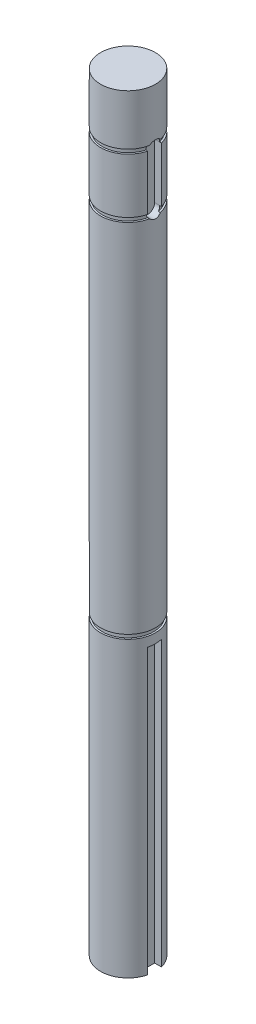
ISO-10303-21;
HEADER;
FILE_DESCRIPTION(('STEP AP214'),'2;1');
FILE_NAME('part.step','',(''),(''),'','','');
FILE_SCHEMA(('AUTOMOTIVE_DESIGN { 1 0 10303 214 1 1 1 1 }'));
ENDSEC;
DATA;
#1=APPLICATION_CONTEXT('core data for automotive mechanical design processes');
#2=APPLICATION_PROTOCOL_DEFINITION('international standard','automotive_design',2000,#1);
#3=PRODUCT_CONTEXT('',#1,'mechanical');
#4=PRODUCT('Part','Part','',(#3));
#5=PRODUCT_RELATED_PRODUCT_CATEGORY('part','',(#4));
#6=PRODUCT_DEFINITION_FORMATION('','',#4);
#7=PRODUCT_DEFINITION_CONTEXT('part definition',#1,'design');
#8=PRODUCT_DEFINITION('design','',#6,#7);
#9=PRODUCT_DEFINITION_SHAPE('','',#8);
#10=(LENGTH_UNIT() NAMED_UNIT(*) SI_UNIT(.MILLI.,.METRE.));
#11=(NAMED_UNIT(*) PLANE_ANGLE_UNIT() SI_UNIT($,.RADIAN.));
#12=(NAMED_UNIT(*) SI_UNIT($,.STERADIAN.) SOLID_ANGLE_UNIT());
#13=UNCERTAINTY_MEASURE_WITH_UNIT(LENGTH_MEASURE(1.E-05),#10,'distance_accuracy_value','');
#14=(GEOMETRIC_REPRESENTATION_CONTEXT(3) GLOBAL_UNCERTAINTY_ASSIGNED_CONTEXT((#13)) GLOBAL_UNIT_ASSIGNED_CONTEXT((#10,
#11,#12)) REPRESENTATION_CONTEXT('',''));
#15=CARTESIAN_POINT('',(0.,0.,0.));
#16=DIRECTION('',(0.,0.,1.));
#17=DIRECTION('',(1.,0.,0.));
#18=AXIS2_PLACEMENT_3D('',#15,#16,#17);
#19=CARTESIAN_POINT('',(0.,0.,0.));
#20=DIRECTION('',(0.,1.,0.));
#21=DIRECTION('',(0.,0.,1.));
#22=AXIS2_PLACEMENT_3D('',#19,#20,#21);
#23=PLANE('',#22);
#24=DIRECTION('',(1.,0.,0.));
#25=VECTOR('',#24,1.);
#26=CARTESIAN_POINT('',(0.,0.,-0.625000000000001));
#27=LINE('',#26,#25);
#28=CARTESIAN_POINT('',(1.8,0.,-0.625000000000001));
#29=VERTEX_POINT('',#28);
#30=CARTESIAN_POINT('',(2.42061459137964,0.,-0.624999999999992));
#31=VERTEX_POINT('',#30);
#32=EDGE_CURVE('E156',#29,#31,#27,.T.);
#33=ORIENTED_EDGE('',*,*,#32,.F.);
#34=DIRECTION('',(0.,0.,1.));
#35=VECTOR('',#34,1.);
#36=CARTESIAN_POINT('',(1.8,0.,0.));
#37=LINE('',#36,#35);
#38=CARTESIAN_POINT('',(1.8,0.,0.624999999999999));
#39=VERTEX_POINT('',#38);
#40=EDGE_CURVE('E11',#29,#39,#37,.T.);
#41=ORIENTED_EDGE('',*,*,#40,.T.);
#42=DIRECTION('',(1.,0.,0.));
#43=VECTOR('',#42,1.);
#44=CARTESIAN_POINT('',(0.,0.,0.624999999999999));
#45=LINE('',#44,#43);
#46=CARTESIAN_POINT('',(2.42061459137964,0.,0.625000000000008));
#47=VERTEX_POINT('',#46);
#48=EDGE_CURVE('E153',#39,#47,#45,.T.);
#49=ORIENTED_EDGE('',*,*,#48,.T.);
#50=CARTESIAN_POINT('',(0.,0.,0.));
#51=DIRECTION('',(0.,1.,0.));
#52=DIRECTION('',(0.,0.,1.));
#53=AXIS2_PLACEMENT_3D('',#50,#51,#52);
#54=CIRCLE('',#53,2.5);
#55=EDGE_CURVE('E291',#31,#47,#54,.T.);
#56=ORIENTED_EDGE('',*,*,#55,.F.);
#57=EDGE_LOOP('',(#33,#41,#49,#56));
#58=FACE_BOUND('',#57,.T.);
#59=ADVANCED_FACE('F33',(#58),#23,.F.);
#60=CARTESIAN_POINT('',(0.,70.,0.));
#61=DIRECTION('',(0.,-1.,0.));
#62=DIRECTION('',(0.,0.,-1.));
#63=AXIS2_PLACEMENT_3D('',#60,#61,#62);
#64=CYLINDRICAL_SURFACE('',#63,2.5);
#65=CARTESIAN_POINT('',(0.,26.72,0.));
#66=DIRECTION('',(0.,-1.,0.));
#67=DIRECTION('',(0.,0.,-1.));
#68=AXIS2_PLACEMENT_3D('',#65,#66,#67);
#69=CIRCLE('',#68,2.5);
#70=CARTESIAN_POINT('',(0.,26.72,-2.5));
#71=VERTEX_POINT('',#70);
#72=EDGE_CURVE('E231',#71,#71,#69,.T.);
#73=ORIENTED_EDGE('',*,*,#72,.T.);
#74=EDGE_LOOP('',(#73));
#75=FACE_BOUND('',#74,.T.);
#76=CARTESIAN_POINT('',(0.,25.86,0.));
#77=DIRECTION('',(0.,-1.,0.));
#78=DIRECTION('',(0.,0.,-1.));
#79=AXIS2_PLACEMENT_3D('',#76,#77,#78);
#80=CIRCLE('',#79,2.5);
#81=CARTESIAN_POINT('',(2.42061459137964,25.86,-0.624999999999998));
#82=VERTEX_POINT('',#81);
#83=CARTESIAN_POINT('',(2.42061459137964,25.86,0.625000000000002));
#84=VERTEX_POINT('',#83);
#85=EDGE_CURVE('E238',#82,#84,#80,.T.);
#86=ORIENTED_EDGE('',*,*,#85,.F.);
#87=DIRECTION('',(0.,-1.,0.));
#88=VECTOR('',#87,1.);
#89=CARTESIAN_POINT('',(2.42061459137964,70.,-0.624999999999992));
#90=LINE('',#89,#88);
#91=EDGE_CURVE('E42',#31,#82,#90,.F.);
#92=ORIENTED_EDGE('',*,*,#91,.F.);
#93=ORIENTED_EDGE('',*,*,#55,.T.);
#94=DIRECTION('',(0.,-1.,0.));
#95=VECTOR('',#94,1.);
#96=CARTESIAN_POINT('',(2.42061459137964,70.,0.625000000000008));
#97=LINE('',#96,#95);
#98=EDGE_CURVE('E294',#47,#84,#97,.F.);
#99=ORIENTED_EDGE('',*,*,#98,.T.);
#100=EDGE_LOOP('',(#86,#92,#93,#99));
#101=FACE_BOUND('',#100,.T.);
#102=ADVANCED_FACE('F283',(#75,#101),#64,.T.);
#103=DIRECTION('',(0.,-1.,0.));
#104=VECTOR('',#103,1.);
#105=CARTESIAN_POINT('',(2.42061459137964,70.,-0.624999999999999));
#106=LINE('',#105,#104);
#107=CARTESIAN_POINT('',(2.42061459137964,60.,-0.625));
#108=VERTEX_POINT('',#107);
#109=CARTESIAN_POINT('',(2.42061459137964,65.,-0.625));
#110=VERTEX_POINT('',#109);
#111=EDGE_CURVE('E377',#108,#110,#106,.F.);
#112=ORIENTED_EDGE('',*,*,#111,.F.);
#113=CARTESIAN_POINT('',(0.,60.,0.));
#114=DIRECTION('',(0.,1.,0.));
#115=DIRECTION('',(0.,0.,1.));
#116=AXIS2_PLACEMENT_3D('',#113,#114,#115);
#117=CIRCLE('',#116,2.5);
#118=CARTESIAN_POINT('',(2.42061459137964,60.,0.624999999999999));
#119=VERTEX_POINT('',#118);
#120=EDGE_CURVE('E330',#108,#119,#117,.T.);
#121=ORIENTED_EDGE('',*,*,#120,.T.);
#122=DIRECTION('',(0.,-1.,0.));
#123=VECTOR('',#122,1.);
#124=CARTESIAN_POINT('',(2.42061459137964,70.,0.625000000000001));
#125=LINE('',#124,#123);
#126=CARTESIAN_POINT('',(2.42061459137964,65.,0.625));
#127=VERTEX_POINT('',#126);
#128=EDGE_CURVE('E378',#119,#127,#125,.F.);
#129=ORIENTED_EDGE('',*,*,#128,.T.);
#130=CARTESIAN_POINT('',(0.,65.,0.));
#131=DIRECTION('',(0.,-1.,0.));
#132=DIRECTION('',(0.,0.,-1.));
#133=AXIS2_PLACEMENT_3D('',#130,#131,#132);
#134=CIRCLE('',#133,2.5);
#135=EDGE_CURVE('E353',#127,#110,#134,.T.);
#136=ORIENTED_EDGE('',*,*,#135,.T.);
#137=EDGE_LOOP('',(#112,#121,#129,#136));
#138=FACE_BOUND('',#137,.T.);
#139=ADVANCED_FACE('F278',(#138),#64,.T.);
#140=CARTESIAN_POINT('',(0.,65.,10.3427403474237));
#141=DIRECTION('',(0.,-1.,0.));
#142=DIRECTION('',(0.,0.,-1.));
#143=AXIS2_PLACEMENT_3D('',#140,#141,#142);
#144=PLANE('',#143);
#145=DIRECTION('',(1.,0.,0.));
#146=VECTOR('',#145,1.);
#147=CARTESIAN_POINT('',(1.8,65.,-0.625));
#148=LINE('',#147,#146);
#149=CARTESIAN_POINT('',(2.25498891349825,65.,-0.625));
#150=VERTEX_POINT('',#149);
#151=EDGE_CURVE('E177',#150,#110,#148,.T.);
#152=ORIENTED_EDGE('',*,*,#151,.T.);
#153=ORIENTED_EDGE('',*,*,#135,.F.);
#154=DIRECTION('',(1.,0.,0.));
#155=VECTOR('',#154,1.);
#156=CARTESIAN_POINT('',(1.8,65.,0.625));
#157=LINE('',#156,#155);
#158=CARTESIAN_POINT('',(2.25498891349825,65.,0.625));
#159=VERTEX_POINT('',#158);
#160=EDGE_CURVE('E173',#159,#127,#157,.T.);
#161=ORIENTED_EDGE('',*,*,#160,.F.);
#162=CARTESIAN_POINT('',(0.,65.,0.));
#163=DIRECTION('',(0.,1.,0.));
#164=DIRECTION('',(0.,0.,1.));
#165=AXIS2_PLACEMENT_3D('',#162,#163,#164);
#166=CIRCLE('',#165,2.34);
#167=EDGE_CURVE('E345',#150,#159,#166,.T.);
#168=ORIENTED_EDGE('',*,*,#167,.F.);
#169=EDGE_LOOP('',(#152,#153,#161,#168));
#170=FACE_BOUND('',#169,.T.);
#171=ADVANCED_FACE('F274',(#170),#144,.F.);
#172=CARTESIAN_POINT('',(0.,65.39,10.3427403474237));
#173=DIRECTION('',(0.,1.,0.));
#174=DIRECTION('',(0.,0.,1.));
#175=AXIS2_PLACEMENT_3D('',#172,#173,#174);
#176=PLANE('',#175);
#177=CARTESIAN_POINT('',(0.,65.39,0.));
#178=DIRECTION('',(0.,1.,0.));
#179=DIRECTION('',(0.,0.,1.));
#180=AXIS2_PLACEMENT_3D('',#177,#178,#179);
#181=CIRCLE('',#180,2.34);
#182=CARTESIAN_POINT('',(2.28846564317667,65.39,-0.488390212842148));
#183=VERTEX_POINT('',#182);
#184=CARTESIAN_POINT('',(2.28846564317667,65.39,0.488390212842148));
#185=VERTEX_POINT('',#184);
#186=EDGE_CURVE('E342',#183,#185,#181,.T.);
#187=ORIENTED_EDGE('',*,*,#186,.T.);
#188=DIRECTION('',(1.,0.,0.));
#189=VECTOR('',#188,1.);
#190=CARTESIAN_POINT('',(1.8,65.39,0.488390212842148));
#191=LINE('',#190,#189);
#192=CARTESIAN_POINT('',(2.45183094849543,65.39,0.488390212842148));
#193=VERTEX_POINT('',#192);
#194=EDGE_CURVE('E260',#185,#193,#191,.T.);
#195=ORIENTED_EDGE('',*,*,#194,.T.);
#196=CARTESIAN_POINT('',(0.,65.39,0.));
#197=DIRECTION('',(0.,1.,0.));
#198=DIRECTION('',(0.,0.,1.));
#199=AXIS2_PLACEMENT_3D('',#196,#197,#198);
#200=CIRCLE('',#199,2.5);
#201=CARTESIAN_POINT('',(2.45183094849543,65.39,-0.488390212842148));
#202=VERTEX_POINT('',#201);
#203=EDGE_CURVE('E349',#202,#193,#200,.T.);
#204=ORIENTED_EDGE('',*,*,#203,.F.);
#205=DIRECTION('',(1.,0.,0.));
#206=VECTOR('',#205,1.);
#207=CARTESIAN_POINT('',(1.8,65.39,-0.488390212842148));
#208=LINE('',#207,#206);
#209=EDGE_CURVE('E376',#202,#183,#208,.F.);
#210=ORIENTED_EDGE('',*,*,#209,.T.);
#211=EDGE_LOOP('',(#187,#195,#204,#210));
#212=FACE_BOUND('',#211,.T.);
#213=ADVANCED_FACE('F272',(#212),#176,.F.);
#214=CARTESIAN_POINT('',(0.,67.145702963128,0.));
#215=DIRECTION('',(0.,1.,0.));
#216=DIRECTION('',(0.,0.,1.));
#217=AXIS2_PLACEMENT_3D('',#214,#215,#216);
#218=CYLINDRICAL_SURFACE('',#217,2.34);
#219=ORIENTED_EDGE('',*,*,#167,.T.);
#220=CARTESIAN_POINT('',(2.25498891349825,65.,0.625));
#221=CARTESIAN_POINT('',(2.2549577676071,65.0349451676806,0.625031242881273));
#222=CARTESIAN_POINT('',(2.25580142119508,65.0698639742977,0.62207010779259));
#223=CARTESIAN_POINT('',(2.2589500737712,65.1377027398278,0.610576459427105));
#224=CARTESIAN_POINT('',(2.26121368163625,65.1706512841825,0.602201551401812));
#225=CARTESIAN_POINT('',(2.26706996716942,65.2361109133674,0.579765859672448));
#226=CARTESIAN_POINT('',(2.27071829563075,65.2685342964658,0.565464301459904));
#227=CARTESIAN_POINT('',(2.27898384198627,65.3313752345228,0.531171536249042));
#228=CARTESIAN_POINT('',(2.28362684375595,65.361703429967,0.511022506756532));
#229=CARTESIAN_POINT('',(2.28846564317667,65.39,0.488390212842145));
#230=B_SPLINE_CURVE_WITH_KNOTS('',3,(#220,#221,#222,#223,#224,#225,#226,#227,#228,#229),
.UNSPECIFIED.,.F.,.F.,(4,2,2,2,4),(0.,0.104657709850381,0.206398045239275,0.312755280421573,
0.422303330243629),.UNSPECIFIED.);
#231=EDGE_CURVE('E259',#159,#185,#230,.T.);
#232=ORIENTED_EDGE('',*,*,#231,.T.);
#233=ORIENTED_EDGE('',*,*,#186,.F.);
#234=CARTESIAN_POINT('',(2.28846564317667,65.39,-0.488390212842148));
#235=CARTESIAN_POINT('',(2.28377829713318,65.3625732574471,-0.510321079523728));
#236=CARTESIAN_POINT('',(2.27927222148687,65.3332456660861,-0.529922187080841));
#237=CARTESIAN_POINT('',(2.27120447844851,65.2725098261348,-0.563495224923729));
#238=CARTESIAN_POINT('',(2.26761972594627,65.2411837706113,-0.577610547747851));
#239=CARTESIAN_POINT('',(2.26160985513081,65.1759739804003,-0.600727130319747));
#240=CARTESIAN_POINT('',(2.25920557537542,65.1420557151607,-0.609636984124143));
#241=CARTESIAN_POINT('',(2.25585465538172,65.0721223954405,-0.621878136616292));
#242=CARTESIAN_POINT('',(2.25495320411917,65.0360749974155,-0.625036746668476));
#243=CARTESIAN_POINT('',(2.25498891349825,65.,-0.625));
#244=B_SPLINE_CURVE_WITH_KNOTS('',3,(#234,#235,#236,#237,#238,#239,#240,#241,#242,#243),
.UNSPECIFIED.,.F.,.F.,(4,2,2,2,4),(0.,0.106169432309091,0.20933931542816,0.31427023276521,
0.42230292818043),.UNSPECIFIED.);
#245=EDGE_CURVE('E252',#183,#150,#244,.T.);
#246=ORIENTED_EDGE('',*,*,#245,.T.);
#247=EDGE_LOOP('',(#219,#232,#233,#246));
#248=FACE_BOUND('',#247,.T.);
#249=ADVANCED_FACE('F266',(#248),#218,.T.);
#250=CARTESIAN_POINT('',(0.,70.,0.));
#251=DIRECTION('',(0.,1.,0.));
#252=DIRECTION('',(0.,0.,1.));
#253=AXIS2_PLACEMENT_3D('',#250,#251,#252);
#254=PLANE('',#253);
#255=CARTESIAN_POINT('',(0.,70.,0.));
#256=DIRECTION('',(0.,1.,0.));
#257=DIRECTION('',(0.,0.,1.));
#258=AXIS2_PLACEMENT_3D('',#255,#256,#257);
#259=CIRCLE('',#258,2.5);
#260=CARTESIAN_POINT('',(0.,70.,2.5));
#261=VERTEX_POINT('',#260);
#262=EDGE_CURVE('E230',#261,#261,#259,.T.);
#263=ORIENTED_EDGE('',*,*,#262,.T.);
#264=EDGE_LOOP('',(#263));
#265=FACE_BOUND('',#264,.T.);
#266=ADVANCED_FACE('F271',(#265),#254,.T.);
#267=ORIENTED_EDGE('',*,*,#203,.T.);
#268=CARTESIAN_POINT('',(2.45183094849543,65.39,0.488390212842148));
#269=CARTESIAN_POINT('',(2.45620985079356,65.4175173550436,0.466446135173251));
#270=CARTESIAN_POINT('',(2.46073522955007,65.4431341262447,0.442157383459968));
#271=CARTESIAN_POINT('',(2.46959668145522,65.4899643442063,0.389604143855876));
#272=CARTESIAN_POINT('',(2.47393267692812,65.5111759973507,0.361338044349884));
#273=CARTESIAN_POINT('',(2.48193206156887,65.5485859134028,0.30153803479316));
#274=CARTESIAN_POINT('',(2.48559489195543,65.5647800189204,0.270001443630932));
#275=CARTESIAN_POINT('',(2.49183240360243,65.5916292851773,0.204569439455392));
#276=CARTESIAN_POINT('',(2.49440775858927,65.6022878762921,0.170675502100788));
#277=CARTESIAN_POINT('',(2.49814743480022,65.6175921843235,0.102075270104229));
#278=CARTESIAN_POINT('',(2.49933459123758,65.6223352975146,0.0673919786486349));
#279=CARTESIAN_POINT('',(2.500241728989,65.6259689049068,-0.00230266926769592));
#280=CARTESIAN_POINT('',(2.49996165472389,65.6248591774004,-0.0373140381059599));
#281=CARTESIAN_POINT('',(2.49798767082826,65.6169127391009,-0.10587479924824));
#282=CARTESIAN_POINT('',(2.49632412393997,65.6101990064931,-0.139439444588614));
#283=CARTESIAN_POINT('',(2.49180073116005,65.5914205546413,-0.204959205697202));
#284=CARTESIAN_POINT('',(2.48894057007017,65.5793544254805,-0.236913894902805));
#285=CARTESIAN_POINT('',(2.48228901347954,65.5500806489104,-0.298694706388588));
#286=CARTESIAN_POINT('',(2.47848772354246,65.5328179220008,-0.328493557902181));
#287=CARTESIAN_POINT('',(2.47037297246938,65.493691790764,-0.384793070669462));
#288=CARTESIAN_POINT('',(2.46606009386891,65.4718335976959,-0.411297414178223));
#289=CARTESIAN_POINT('',(2.4600624671058,65.4388766288402,-0.44517843984157));
#290=CARTESIAN_POINT('',(2.45840021313174,65.4294736153385,-0.454255959435429));
#291=CARTESIAN_POINT('',(2.45509547337905,65.4101333528005,-0.471789471966371));
#292=CARTESIAN_POINT('',(2.45345295711915,65.4001971076006,-0.480246566408103));
#293=CARTESIAN_POINT('',(2.45183094849543,65.39,-0.488390212842182));
#294=B_SPLINE_CURVE_WITH_KNOTS('',3,(#268,#269,#270,#271,#272,#273,#274,#275,#276,#277,#278,
#279,#280,#281,#282,#283,#284,#285,#286,#287,#288,#289,#290,#291,#292,#293),.UNSPECIFIED.,.F.,
.F.,(4,2,2,2,2,2,2,2,2,2,2,2,4),(0.,0.106271829539017,0.212586844928897,0.318989715642145,
0.425326569252446,0.529888464917002,0.634454321447651,0.736784052545574,0.839140755143262,
0.942623020441684,1.04598856376481,1.08549382972696,1.12492716962116),.UNSPECIFIED.);
#295=EDGE_CURVE('E229',#193,#202,#294,.T.);
#296=ORIENTED_EDGE('',*,*,#295,.T.);
#297=EDGE_LOOP('',(#267,#296));
#298=FACE_BOUND('',#297,.T.);
#299=ORIENTED_EDGE('',*,*,#262,.F.);
#300=EDGE_LOOP('',(#299));
#301=FACE_BOUND('',#300,.T.);
#302=ADVANCED_FACE('F35',(#298,#301),#64,.T.);
#303=CARTESIAN_POINT('',(0.,59.61,14.1547308574175));
#304=DIRECTION('',(0.,-1.,0.));
#305=DIRECTION('',(0.,0.,-1.));
#306=AXIS2_PLACEMENT_3D('',#303,#304,#305);
#307=PLANE('',#306);
#308=CARTESIAN_POINT('',(0.,59.61,0.));
#309=DIRECTION('',(0.,1.,0.));
#310=DIRECTION('',(0.,0.,1.));
#311=AXIS2_PLACEMENT_3D('',#308,#309,#310);
#312=CIRCLE('',#311,2.34);
#313=CARTESIAN_POINT('',(2.28846564317667,59.61,-0.488390212842154));
#314=VERTEX_POINT('',#313);
#315=CARTESIAN_POINT('',(2.28846564317667,59.61,0.488390212842154));
#316=VERTEX_POINT('',#315);
#317=EDGE_CURVE('E334',#314,#316,#312,.T.);
#318=ORIENTED_EDGE('',*,*,#317,.F.);
#319=DIRECTION('',(1.,0.,0.));
#320=VECTOR('',#319,1.);
#321=CARTESIAN_POINT('',(1.8,59.61,-0.488390212842154));
#322=LINE('',#321,#320);
#323=CARTESIAN_POINT('',(2.45183094849543,59.61,-0.488390212842154));
#324=VERTEX_POINT('',#323);
#325=EDGE_CURVE('E190',#314,#324,#322,.T.);
#326=ORIENTED_EDGE('',*,*,#325,.T.);
#327=CARTESIAN_POINT('',(0.,59.61,0.));
#328=DIRECTION('',(0.,-1.,0.));
#329=DIRECTION('',(0.,0.,-1.));
#330=AXIS2_PLACEMENT_3D('',#327,#328,#329);
#331=CIRCLE('',#330,2.5);
#332=CARTESIAN_POINT('',(2.45183094849543,59.61,0.488390212842154));
#333=VERTEX_POINT('',#332);
#334=EDGE_CURVE('E346',#333,#324,#331,.T.);
#335=ORIENTED_EDGE('',*,*,#334,.F.);
#336=DIRECTION('',(1.,0.,0.));
#337=VECTOR('',#336,1.);
#338=CARTESIAN_POINT('',(1.8,59.61,0.488390212842154));
#339=LINE('',#338,#337);
#340=EDGE_CURVE('E57',#333,#316,#339,.F.);
#341=ORIENTED_EDGE('',*,*,#340,.T.);
#342=EDGE_LOOP('',(#318,#326,#335,#341));
#343=FACE_BOUND('',#342,.T.);
#344=ADVANCED_FACE('F398',(#343),#307,.F.);
#345=CARTESIAN_POINT('',(0.,60.,14.1547308574175));
#346=DIRECTION('',(0.,1.,0.));
#347=DIRECTION('',(0.,0.,1.));
#348=AXIS2_PLACEMENT_3D('',#345,#346,#347);
#349=PLANE('',#348);
#350=ORIENTED_EDGE('',*,*,#120,.F.);
#351=DIRECTION('',(1.,0.,0.));
#352=VECTOR('',#351,1.);
#353=CARTESIAN_POINT('',(1.8,60.,-0.625));
#354=LINE('',#353,#352);
#355=CARTESIAN_POINT('',(2.25498891349825,60.,-0.625));
#356=VERTEX_POINT('',#355);
#357=EDGE_CURVE('E181',#356,#108,#354,.T.);
#358=ORIENTED_EDGE('',*,*,#357,.F.);
#359=CARTESIAN_POINT('',(0.,60.,0.));
#360=DIRECTION('',(0.,1.,0.));
#361=DIRECTION('',(0.,0.,1.));
#362=AXIS2_PLACEMENT_3D('',#359,#360,#361);
#363=CIRCLE('',#362,2.34);
#364=CARTESIAN_POINT('',(2.25498891349825,60.,0.624999999999999));
#365=VERTEX_POINT('',#364);
#366=EDGE_CURVE('E328',#356,#365,#363,.T.);
#367=ORIENTED_EDGE('',*,*,#366,.T.);
#368=DIRECTION('',(1.,0.,0.));
#369=VECTOR('',#368,1.);
#370=CARTESIAN_POINT('',(1.8,60.,0.624999999999999));
#371=LINE('',#370,#369);
#372=EDGE_CURVE('E185',#365,#119,#371,.T.);
#373=ORIENTED_EDGE('',*,*,#372,.T.);
#374=EDGE_LOOP('',(#350,#358,#367,#373));
#375=FACE_BOUND('',#374,.T.);
#376=ADVANCED_FACE('F327',(#375),#349,.F.);
#377=CARTESIAN_POINT('',(0.,61.0146084361061,0.));
#378=DIRECTION('',(0.,1.,0.));
#379=DIRECTION('',(0.,0.,1.));
#380=AXIS2_PLACEMENT_3D('',#377,#378,#379);
#381=CYLINDRICAL_SURFACE('',#380,2.34);
#382=ORIENTED_EDGE('',*,*,#317,.T.);
#383=CARTESIAN_POINT('',(2.28846564317667,59.61,0.488390212842154));
#384=CARTESIAN_POINT('',(2.28377829713318,59.6374267425529,0.510321079523733));
#385=CARTESIAN_POINT('',(2.27927222148687,59.6667543339139,0.529922187080846));
#386=CARTESIAN_POINT('',(2.27120447844851,59.7274901738653,0.563495224923732));
#387=CARTESIAN_POINT('',(2.26761972594627,59.7588162293887,0.577610547747853));
#388=CARTESIAN_POINT('',(2.26160985513081,59.8240260195997,0.600727130319747));
#389=CARTESIAN_POINT('',(2.25920557537542,59.8579442848393,0.609636984124142));
#390=CARTESIAN_POINT('',(2.25585465538172,59.9278776045595,0.62187813661629));
#391=CARTESIAN_POINT('',(2.25495320411917,59.9639250025846,0.625036746668475));
#392=CARTESIAN_POINT('',(2.25498891349825,60.,0.625));
#393=B_SPLINE_CURVE_WITH_KNOTS('',3,(#383,#384,#385,#386,#387,#388,#389,#390,#391,#392),
.UNSPECIFIED.,.F.,.F.,(4,2,2,2,4),(0.,0.106169432309084,0.209339315428145,0.314270232765202,
0.422302928180429),.UNSPECIFIED.);
#394=EDGE_CURVE('E201',#316,#365,#393,.T.);
#395=ORIENTED_EDGE('',*,*,#394,.T.);
#396=ORIENTED_EDGE('',*,*,#366,.F.);
#397=CARTESIAN_POINT('',(2.25498891349825,60.,-0.625));
#398=CARTESIAN_POINT('',(2.2549577676071,59.9650548323194,-0.625031242881273));
#399=CARTESIAN_POINT('',(2.25580142119508,59.9301360257023,-0.622070107792591));
#400=CARTESIAN_POINT('',(2.2589500737712,59.8622972601722,-0.610576459427107));
#401=CARTESIAN_POINT('',(2.26121368163625,59.8293487158175,-0.602201551401814));
#402=CARTESIAN_POINT('',(2.26706996716942,59.7638890866326,-0.579765859672454));
#403=CARTESIAN_POINT('',(2.27071829563075,59.7314657035342,-0.565464301459912));
#404=CARTESIAN_POINT('',(2.27898384198626,59.6686247654772,-0.531171536249052));
#405=CARTESIAN_POINT('',(2.28362684375595,59.638296570033,-0.511022506756541));
#406=CARTESIAN_POINT('',(2.28846564317667,59.61,-0.488390212842151));
#407=B_SPLINE_CURVE_WITH_KNOTS('',3,(#397,#398,#399,#400,#401,#402,#403,#404,#405,#406),
.UNSPECIFIED.,.F.,.F.,(4,2,2,2,4),(0.,0.10465770985038,0.206398045239267,0.312755280421562,
0.422303330243633),.UNSPECIFIED.);
#408=EDGE_CURVE('E193',#356,#314,#407,.T.);
#409=ORIENTED_EDGE('',*,*,#408,.T.);
#410=EDGE_LOOP('',(#382,#395,#396,#409));
#411=FACE_BOUND('',#410,.T.);
#412=ADVANCED_FACE('F206',(#411),#381,.T.);
#413=CARTESIAN_POINT('',(0.,27.11,0.));
#414=DIRECTION('',(0.,1.,0.));
#415=DIRECTION('',(0.,0.,1.));
#416=AXIS2_PLACEMENT_3D('',#413,#414,#415);
#417=CIRCLE('',#416,2.5);
#418=CARTESIAN_POINT('',(0.,27.11,2.5));
#419=VERTEX_POINT('',#418);
#420=EDGE_CURVE('E338',#419,#419,#417,.T.);
#421=ORIENTED_EDGE('',*,*,#420,.T.);
#422=EDGE_LOOP('',(#421));
#423=FACE_BOUND('',#422,.T.);
#424=ORIENTED_EDGE('',*,*,#334,.T.);
#425=CARTESIAN_POINT('',(2.45183094849543,59.61,-0.488390212842154));
#426=CARTESIAN_POINT('',(2.45620985079355,59.5824826449564,-0.466446135173262));
#427=CARTESIAN_POINT('',(2.46073522955007,59.5568658737553,-0.442157383459975));
#428=CARTESIAN_POINT('',(2.46959668145522,59.5100356557937,-0.389604143855875));
#429=CARTESIAN_POINT('',(2.47393267692812,59.4888240026494,-0.36133804434988));
#430=CARTESIAN_POINT('',(2.48193206156887,59.4514140865972,-0.301538034793154));
#431=CARTESIAN_POINT('',(2.48559489195543,59.4352199810796,-0.270001443630927));
#432=CARTESIAN_POINT('',(2.49183240360243,59.4083707148226,-0.204569439455387));
#433=CARTESIAN_POINT('',(2.49440775858927,59.3977121237079,-0.170675502100782));
#434=CARTESIAN_POINT('',(2.49814743480022,59.3824078156765,-0.102075270104223));
#435=CARTESIAN_POINT('',(2.49933459123758,59.3776647024854,-0.0673919786486295));
#436=CARTESIAN_POINT('',(2.500241728989,59.3740310950932,0.00230266926770128));
#437=CARTESIAN_POINT('',(2.49996165472389,59.3751408225996,0.0373140381059658));
#438=CARTESIAN_POINT('',(2.49798767082826,59.3830872608991,0.105874799248246));
#439=CARTESIAN_POINT('',(2.49632412393997,59.3898009935069,0.139439444588619));
#440=CARTESIAN_POINT('',(2.49180073116005,59.4085794453587,0.204959205697207));
#441=CARTESIAN_POINT('',(2.48894057007017,59.4206455745195,0.236913894902809));
#442=CARTESIAN_POINT('',(2.48228901347954,59.4499193510896,0.298694706388591));
#443=CARTESIAN_POINT('',(2.47848772354246,59.4671820779992,0.328493557902184));
#444=CARTESIAN_POINT('',(2.47037297246938,59.506308209236,0.384793070669467));
#445=CARTESIAN_POINT('',(2.46606009386891,59.5281664023041,0.411297414178229));
#446=CARTESIAN_POINT('',(2.4600624671058,59.5611233711598,0.445178439841572));
#447=CARTESIAN_POINT('',(2.45840021313174,59.5705263846615,0.454255959435428));
#448=CARTESIAN_POINT('',(2.45509547337905,59.5898666471995,0.47178947196637));
#449=CARTESIAN_POINT('',(2.45345295711915,59.5998028923994,0.480246566408104));
#450=CARTESIAN_POINT('',(2.45183094849543,59.61,0.488390212842188));
#451=B_SPLINE_CURVE_WITH_KNOTS('',3,(#425,#426,#427,#428,#429,#430,#431,#432,#433,#434,#435,
#436,#437,#438,#439,#440,#441,#442,#443,#444,#445,#446,#447,#448,#449,#450),.UNSPECIFIED.,.F.,
.F.,(4,2,2,2,2,2,2,2,2,2,2,2,4),(0.,0.106271829539031,0.212586844928905,0.318989715642164,
0.425326569252458,0.529888464917014,0.634454321447664,0.736784052545585,0.839140755143276,
0.942623020441693,1.04598856376482,1.08549382972697,1.12492716962118),.UNSPECIFIED.);
#452=EDGE_CURVE('E223',#324,#333,#451,.T.);
#453=ORIENTED_EDGE('',*,*,#452,.T.);
#454=EDGE_LOOP('',(#424,#453));
#455=FACE_BOUND('',#454,.T.);
#456=ADVANCED_FACE('F385',(#423,#455),#64,.T.);
#457=CARTESIAN_POINT('',(0.,26.72,14.9775105981988));
#458=DIRECTION('',(0.,-1.,0.));
#459=DIRECTION('',(0.,0.,-1.));
#460=AXIS2_PLACEMENT_3D('',#457,#458,#459);
#461=PLANE('',#460);
#462=CARTESIAN_POINT('',(0.,26.72,0.));
#463=DIRECTION('',(0.,1.,0.));
#464=DIRECTION('',(0.,0.,1.));
#465=AXIS2_PLACEMENT_3D('',#462,#463,#464);
#466=CIRCLE('',#465,2.34);
#467=CARTESIAN_POINT('',(0.,26.72,2.34));
#468=VERTEX_POINT('',#467);
#469=EDGE_CURVE('E340',#468,#468,#466,.T.);
#470=ORIENTED_EDGE('',*,*,#469,.F.);
#471=EDGE_LOOP('',(#470));
#472=FACE_BOUND('',#471,.T.);
#473=ORIENTED_EDGE('',*,*,#72,.F.);
#474=EDGE_LOOP('',(#473));
#475=FACE_BOUND('',#474,.T.);
#476=ADVANCED_FACE('F389',(#472,#475),#461,.F.);
#477=CARTESIAN_POINT('',(0.,27.11,14.9775105981988));
#478=DIRECTION('',(0.,1.,0.));
#479=DIRECTION('',(0.,0.,1.));
#480=AXIS2_PLACEMENT_3D('',#477,#478,#479);
#481=PLANE('',#480);
#482=CARTESIAN_POINT('',(0.,27.11,0.));
#483=DIRECTION('',(0.,1.,0.));
#484=DIRECTION('',(0.,0.,1.));
#485=AXIS2_PLACEMENT_3D('',#482,#483,#484);
#486=CIRCLE('',#485,2.34);
#487=CARTESIAN_POINT('',(0.,27.11,2.34));
#488=VERTEX_POINT('',#487);
#489=EDGE_CURVE('E364',#488,#488,#486,.T.);
#490=ORIENTED_EDGE('',*,*,#489,.T.);
#491=EDGE_LOOP('',(#490));
#492=FACE_BOUND('',#491,.T.);
#493=ORIENTED_EDGE('',*,*,#420,.F.);
#494=EDGE_LOOP('',(#493));
#495=FACE_BOUND('',#494,.T.);
#496=ADVANCED_FACE('F246',(#492,#495),#481,.F.);
#497=CARTESIAN_POINT('',(0.,27.3415345074877,0.));
#498=DIRECTION('',(0.,1.,0.));
#499=DIRECTION('',(0.,0.,1.));
#500=AXIS2_PLACEMENT_3D('',#497,#498,#499);
#501=CYLINDRICAL_SURFACE('',#500,2.34);
#502=ORIENTED_EDGE('',*,*,#489,.F.);
#503=EDGE_LOOP('',(#502));
#504=FACE_BOUND('',#503,.T.);
#505=ORIENTED_EDGE('',*,*,#469,.T.);
#506=EDGE_LOOP('',(#505));
#507=FACE_BOUND('',#506,.T.);
#508=ADVANCED_FACE('F244',(#504,#507),#501,.T.);
#509=CARTESIAN_POINT('',(1.8,65.,0.));
#510=DIRECTION('',(1.,0.,0.));
#511=DIRECTION('',(0.,0.,-1.));
#512=AXIS2_PLACEMENT_3D('',#509,#510,#511);
#513=CYLINDRICAL_SURFACE('',#512,0.625);
#514=CARTESIAN_POINT('',(1.8,65.,0.625));
#515=VERTEX_POINT('',#514);
#516=EDGE_CURVE('E186',#515,#159,#157,.T.);
#517=ORIENTED_EDGE('',*,*,#516,.F.);
#518=CARTESIAN_POINT('',(1.8,65.,0.));
#519=DIRECTION('',(1.,0.,0.));
#520=DIRECTION('',(0.,0.,-1.));
#521=AXIS2_PLACEMENT_3D('',#518,#519,#520);
#522=CIRCLE('',#521,0.625);
#523=CARTESIAN_POINT('',(1.8,65.,-0.625));
#524=VERTEX_POINT('',#523);
#525=EDGE_CURVE('E162',#524,#515,#522,.T.);
#526=ORIENTED_EDGE('',*,*,#525,.F.);
#527=EDGE_CURVE('E174',#524,#150,#148,.T.);
#528=ORIENTED_EDGE('',*,*,#527,.T.);
#529=ORIENTED_EDGE('',*,*,#245,.F.);
#530=ORIENTED_EDGE('',*,*,#209,.F.);
#531=ORIENTED_EDGE('',*,*,#295,.F.);
#532=ORIENTED_EDGE('',*,*,#194,.F.);
#533=ORIENTED_EDGE('',*,*,#231,.F.);
#534=EDGE_LOOP('',(#517,#526,#528,#529,#530,#531,#532,#533));
#535=FACE_BOUND('',#534,.T.);
#536=ADVANCED_FACE('F240',(#535),#513,.F.);
#537=CARTESIAN_POINT('',(1.8,65.,-0.625));
#538=DIRECTION('',(0.,0.,1.));
#539=DIRECTION('',(0.,-1.,0.));
#540=AXIS2_PLACEMENT_3D('',#537,#538,#539);
#541=PLANE('',#540);
#542=ORIENTED_EDGE('',*,*,#111,.T.);
#543=ORIENTED_EDGE('',*,*,#151,.F.);
#544=ORIENTED_EDGE('',*,*,#527,.F.);
#545=DIRECTION('',(0.,-1.,0.));
#546=VECTOR('',#545,1.);
#547=CARTESIAN_POINT('',(1.8,65.,-0.625));
#548=LINE('',#547,#546);
#549=CARTESIAN_POINT('',(1.8,60.,-0.625));
#550=VERTEX_POINT('',#549);
#551=EDGE_CURVE('E171',#524,#550,#548,.T.);
#552=ORIENTED_EDGE('',*,*,#551,.T.);
#553=EDGE_CURVE('E178',#550,#356,#354,.T.);
#554=ORIENTED_EDGE('',*,*,#553,.T.);
#555=ORIENTED_EDGE('',*,*,#357,.T.);
#556=EDGE_LOOP('',(#542,#543,#544,#552,#554,#555));
#557=FACE_BOUND('',#556,.T.);
#558=ADVANCED_FACE('F217',(#557),#541,.T.);
#559=CARTESIAN_POINT('',(1.8,65.,0.625));
#560=DIRECTION('',(0.,0.,1.));
#561=DIRECTION('',(0.,-1.,0.));
#562=AXIS2_PLACEMENT_3D('',#559,#560,#561);
#563=PLANE('',#562);
#564=ORIENTED_EDGE('',*,*,#372,.F.);
#565=CARTESIAN_POINT('',(1.8,60.,0.624999999999999));
#566=VERTEX_POINT('',#565);
#567=EDGE_CURVE('E182',#566,#365,#371,.T.);
#568=ORIENTED_EDGE('',*,*,#567,.F.);
#569=DIRECTION('',(0.,-1.,0.));
#570=VECTOR('',#569,1.);
#571=CARTESIAN_POINT('',(1.8,65.,0.625));
#572=LINE('',#571,#570);
#573=EDGE_CURVE('E165',#515,#566,#572,.T.);
#574=ORIENTED_EDGE('',*,*,#573,.F.);
#575=ORIENTED_EDGE('',*,*,#516,.T.);
#576=ORIENTED_EDGE('',*,*,#160,.T.);
#577=ORIENTED_EDGE('',*,*,#128,.F.);
#578=EDGE_LOOP('',(#564,#568,#574,#575,#576,#577));
#579=FACE_BOUND('',#578,.T.);
#580=ADVANCED_FACE('F216',(#579),#563,.F.);
#581=CARTESIAN_POINT('',(1.8,60.,0.));
#582=DIRECTION('',(1.,0.,0.));
#583=DIRECTION('',(0.,0.,-1.));
#584=AXIS2_PLACEMENT_3D('',#581,#582,#583);
#585=CYLINDRICAL_SURFACE('',#584,0.625);
#586=ORIENTED_EDGE('',*,*,#340,.F.);
#587=ORIENTED_EDGE('',*,*,#452,.F.);
#588=ORIENTED_EDGE('',*,*,#325,.F.);
#589=ORIENTED_EDGE('',*,*,#408,.F.);
#590=ORIENTED_EDGE('',*,*,#553,.F.);
#591=CARTESIAN_POINT('',(1.8,60.,0.));
#592=DIRECTION('',(1.,0.,0.));
#593=DIRECTION('',(0.,0.,-1.));
#594=AXIS2_PLACEMENT_3D('',#591,#592,#593);
#595=CIRCLE('',#594,0.625);
#596=EDGE_CURVE('E168',#566,#550,#595,.T.);
#597=ORIENTED_EDGE('',*,*,#596,.F.);
#598=ORIENTED_EDGE('',*,*,#567,.T.);
#599=ORIENTED_EDGE('',*,*,#394,.F.);
#600=EDGE_LOOP('',(#586,#587,#588,#589,#590,#597,#598,#599));
#601=FACE_BOUND('',#600,.T.);
#602=ADVANCED_FACE('F210',(#601),#585,.F.);
#603=CARTESIAN_POINT('',(1.8,65.,0.));
#604=DIRECTION('',(1.,0.,0.));
#605=DIRECTION('',(0.,0.,-1.));
#606=AXIS2_PLACEMENT_3D('',#603,#604,#605);
#607=PLANE('',#606);
#608=ORIENTED_EDGE('',*,*,#525,.T.);
#609=ORIENTED_EDGE('',*,*,#573,.T.);
#610=ORIENTED_EDGE('',*,*,#596,.T.);
#611=ORIENTED_EDGE('',*,*,#551,.F.);
#612=EDGE_LOOP('',(#608,#609,#610,#611));
#613=FACE_BOUND('',#612,.T.);
#614=ADVANCED_FACE('F215',(#613),#607,.T.);
#615=CARTESIAN_POINT('',(1.8,0.,0.));
#616=DIRECTION('',(-1.,0.,0.));
#617=DIRECTION('',(0.,0.,1.));
#618=AXIS2_PLACEMENT_3D('',#615,#616,#617);
#619=PLANE('',#618);
#620=DIRECTION('',(0.,-1.,0.));
#621=VECTOR('',#620,1.);
#622=CARTESIAN_POINT('',(1.8,25.86,-0.624999999999998));
#623=LINE('',#622,#621);
#624=CARTESIAN_POINT('',(1.8,25.86,-0.624999999999998));
#625=VERTEX_POINT('',#624);
#626=EDGE_CURVE('E135',#625,#29,#623,.T.);
#627=ORIENTED_EDGE('',*,*,#626,.F.);
#628=DIRECTION('',(0.,0.,-1.));
#629=VECTOR('',#628,1.);
#630=CARTESIAN_POINT('',(1.8,25.86,0.625000000000002));
#631=LINE('',#630,#629);
#632=CARTESIAN_POINT('',(1.8,25.86,0.625000000000002));
#633=VERTEX_POINT('',#632);
#634=EDGE_CURVE('E139',#633,#625,#631,.T.);
#635=ORIENTED_EDGE('',*,*,#634,.F.);
#636=DIRECTION('',(0.,-1.,0.));
#637=VECTOR('',#636,1.);
#638=CARTESIAN_POINT('',(1.8,25.86,0.625000000000002));
#639=LINE('',#638,#637);
#640=EDGE_CURVE('E143',#633,#39,#639,.T.);
#641=ORIENTED_EDGE('',*,*,#640,.T.);
#642=ORIENTED_EDGE('',*,*,#40,.F.);
#643=EDGE_LOOP('',(#627,#635,#641,#642));
#644=FACE_BOUND('',#643,.T.);
#645=ADVANCED_FACE('F137',(#644),#619,.F.);
#646=CARTESIAN_POINT('',(1.8,25.86,0.625000000000002));
#647=DIRECTION('',(0.,-1.,0.));
#648=DIRECTION('',(0.,0.,-1.));
#649=AXIS2_PLACEMENT_3D('',#646,#647,#648);
#650=PLANE('',#649);
#651=DIRECTION('',(1.,0.,0.));
#652=VECTOR('',#651,1.);
#653=CARTESIAN_POINT('',(1.8,25.86,-0.624999999999998));
#654=LINE('',#653,#652);
#655=EDGE_CURVE('E148',#625,#82,#654,.T.);
#656=ORIENTED_EDGE('',*,*,#655,.T.);
#657=ORIENTED_EDGE('',*,*,#85,.T.);
#658=DIRECTION('',(1.,0.,0.));
#659=VECTOR('',#658,1.);
#660=CARTESIAN_POINT('',(1.8,25.86,0.625000000000002));
#661=LINE('',#660,#659);
#662=EDGE_CURVE('E49',#633,#84,#661,.T.);
#663=ORIENTED_EDGE('',*,*,#662,.F.);
#664=ORIENTED_EDGE('',*,*,#634,.T.);
#665=EDGE_LOOP('',(#656,#657,#663,#664));
#666=FACE_BOUND('',#665,.T.);
#667=ADVANCED_FACE('F147',(#666),#650,.T.);
#668=CARTESIAN_POINT('',(1.8,25.86,-0.624999999999998));
#669=DIRECTION('',(0.,0.,1.));
#670=DIRECTION('',(0.,-1.,0.));
#671=AXIS2_PLACEMENT_3D('',#668,#669,#670);
#672=PLANE('',#671);
#673=ORIENTED_EDGE('',*,*,#32,.T.);
#674=ORIENTED_EDGE('',*,*,#91,.T.);
#675=ORIENTED_EDGE('',*,*,#655,.F.);
#676=ORIENTED_EDGE('',*,*,#626,.T.);
#677=EDGE_LOOP('',(#673,#674,#675,#676));
#678=FACE_BOUND('',#677,.T.);
#679=ADVANCED_FACE('F151',(#678),#672,.T.);
#680=CARTESIAN_POINT('',(1.8,25.86,0.625000000000002));
#681=DIRECTION('',(0.,0.,1.));
#682=DIRECTION('',(0.,-1.,0.));
#683=AXIS2_PLACEMENT_3D('',#680,#681,#682);
#684=PLANE('',#683);
#685=ORIENTED_EDGE('',*,*,#640,.F.);
#686=ORIENTED_EDGE('',*,*,#662,.T.);
#687=ORIENTED_EDGE('',*,*,#98,.F.);
#688=ORIENTED_EDGE('',*,*,#48,.F.);
#689=EDGE_LOOP('',(#685,#686,#687,#688));
#690=FACE_BOUND('',#689,.T.);
#691=ADVANCED_FACE('F295',(#690),#684,.F.);
#692=CLOSED_SHELL('',(#59,#102,#139,#171,#213,#249,#266,#302,#344,#376,#412,#456,#476,#496,#508,
#536,#558,#580,#602,#614,#645,#667,#679,#691));
#693=MANIFOLD_SOLID_BREP('B2',#692);
#694=ADVANCED_BREP_SHAPE_REPRESENTATION('',(#18,#693),#14);
#695=SHAPE_DEFINITION_REPRESENTATION(#9,#694);
ENDSEC;
END-ISO-10303-21;
